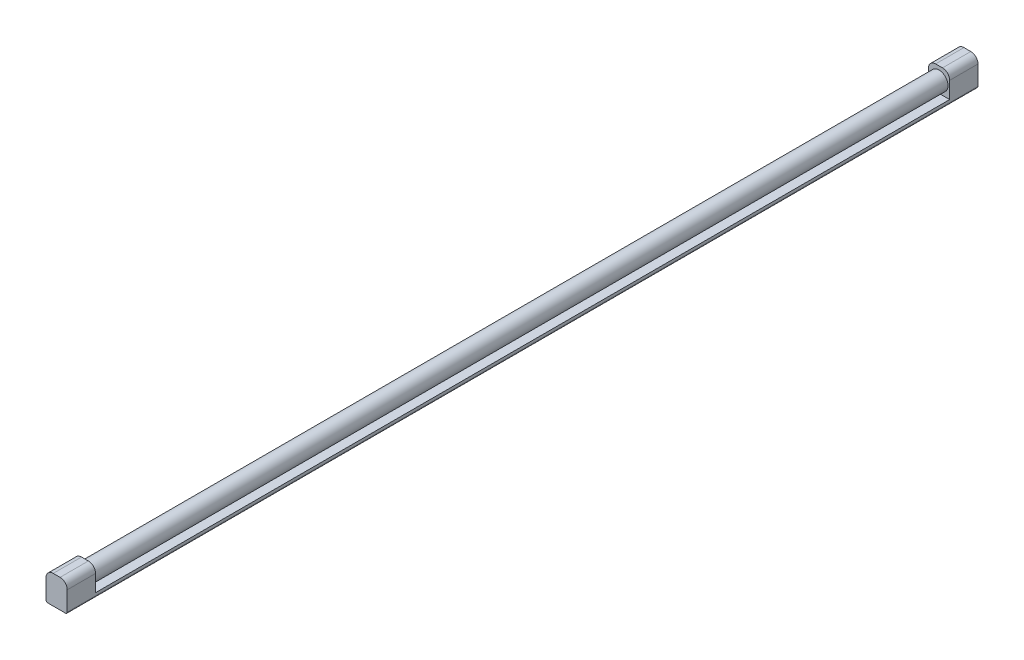
ISO-10303-21;
HEADER;
FILE_DESCRIPTION(('STEP AP214'),'2;1');
FILE_NAME('part.step','',(''),(''),'','','');
FILE_SCHEMA(('AUTOMOTIVE_DESIGN { 1 0 10303 214 1 1 1 1 }'));
ENDSEC;
DATA;
#1=APPLICATION_CONTEXT('core data for automotive mechanical design processes');
#2=APPLICATION_PROTOCOL_DEFINITION('international standard','automotive_design',2000,#1);
#3=PRODUCT_CONTEXT('',#1,'mechanical');
#4=PRODUCT('Part','Part','',(#3));
#5=PRODUCT_RELATED_PRODUCT_CATEGORY('part','',(#4));
#6=PRODUCT_DEFINITION_FORMATION('','',#4);
#7=PRODUCT_DEFINITION_CONTEXT('part definition',#1,'design');
#8=PRODUCT_DEFINITION('design','',#6,#7);
#9=PRODUCT_DEFINITION_SHAPE('','',#8);
#10=(LENGTH_UNIT() NAMED_UNIT(*) SI_UNIT(.MILLI.,.METRE.));
#11=(NAMED_UNIT(*) PLANE_ANGLE_UNIT() SI_UNIT($,.RADIAN.));
#12=(NAMED_UNIT(*) SI_UNIT($,.STERADIAN.) SOLID_ANGLE_UNIT());
#13=UNCERTAINTY_MEASURE_WITH_UNIT(LENGTH_MEASURE(1.E-05),#10,'distance_accuracy_value','');
#14=(GEOMETRIC_REPRESENTATION_CONTEXT(3) GLOBAL_UNCERTAINTY_ASSIGNED_CONTEXT((#13)) GLOBAL_UNIT_ASSIGNED_CONTEXT((#10,
#11,#12)) REPRESENTATION_CONTEXT('',''));
#15=CARTESIAN_POINT('',(0.,0.,0.));
#16=DIRECTION('',(0.,0.,1.));
#17=DIRECTION('',(1.,0.,0.));
#18=AXIS2_PLACEMENT_3D('',#15,#16,#17);
#19=CARTESIAN_POINT('',(0.,0.,40.));
#20=DIRECTION('',(0.,0.,-1.));
#21=DIRECTION('',(-1.,0.,0.));
#22=AXIS2_PLACEMENT_3D('',#19,#20,#21);
#23=PLANE('',#22);
#24=CARTESIAN_POINT('',(15.0000000000017,22.2200000000011,40.));
#25=DIRECTION('',(0.,0.,1.));
#26=DIRECTION('',(1.,0.,0.));
#27=AXIS2_PLACEMENT_3D('',#24,#25,#26);
#28=CIRCLE('',#27,12.7);
#29=CARTESIAN_POINT('',(27.7000000000017,22.2200000000011,40.));
#30=VERTEX_POINT('',#29);
#31=EDGE_CURVE('E230',#30,#30,#28,.T.);
#32=ORIENTED_EDGE('',*,*,#31,.F.);
#33=EDGE_LOOP('',(#32));
#34=FACE_BOUND('',#33,.T.);
#35=DIRECTION('',(-1.,0.,0.));
#36=VECTOR('',#35,1.);
#37=CARTESIAN_POINT('',(6.66133814775094E-12,6.35000000000008,40.));
#38=LINE('',#37,#36);
#39=CARTESIAN_POINT('',(30.0000000000066,6.35000000000052,40.));
#40=VERTEX_POINT('',#39);
#41=CARTESIAN_POINT('',(6.66133814775094E-12,6.35000000000008,40.));
#42=VERTEX_POINT('',#41);
#43=EDGE_CURVE('E51',#40,#42,#38,.T.);
#44=ORIENTED_EDGE('',*,*,#43,.F.);
#45=DIRECTION('',(0.,0.999999999999987,0.));
#46=VECTOR('',#45,1.);
#47=CARTESIAN_POINT('',(30.,4.44089209850063E-13,40.));
#48=LINE('',#47,#46);
#49=CARTESIAN_POINT('',(30.,29.8400000000003,40.));
#50=VERTEX_POINT('',#49);
#51=EDGE_CURVE('E285',#40,#50,#48,.T.);
#52=ORIENTED_EDGE('',*,*,#51,.T.);
#53=CARTESIAN_POINT('',(19.8400000000001,29.8400000000009,40.));
#54=DIRECTION('',(0.,0.,-1.));
#55=DIRECTION('',(-1.,0.,0.));
#56=AXIS2_PLACEMENT_3D('',#53,#54,#55);
#57=CIRCLE('',#56,10.16);
#58=CARTESIAN_POINT('',(19.840000000005,40.000000000001,40.));
#59=VERTEX_POINT('',#58);
#60=EDGE_CURVE('E314',#50,#59,#57,.F.);
#61=ORIENTED_EDGE('',*,*,#60,.T.);
#62=DIRECTION('',(-1.,0.,0.));
#63=VECTOR('',#62,1.);
#64=CARTESIAN_POINT('',(4.9960036108132E-12,40.,40.));
#65=LINE('',#64,#63);
#66=CARTESIAN_POINT('',(10.1600000000049,40.0000000000014,40.));
#67=VERTEX_POINT('',#66);
#68=EDGE_CURVE('E288',#59,#67,#65,.T.);
#69=ORIENTED_EDGE('',*,*,#68,.T.);
#70=CARTESIAN_POINT('',(10.1600000000001,29.8400000000012,40.));
#71=DIRECTION('',(0.,0.,-1.));
#72=DIRECTION('',(-1.,0.,0.));
#73=AXIS2_PLACEMENT_3D('',#70,#71,#72);
#74=CIRCLE('',#73,10.16);
#75=CARTESIAN_POINT('',(0.,29.8399999999999,40.));
#76=VERTEX_POINT('',#75);
#77=EDGE_CURVE('E312',#67,#76,#74,.F.);
#78=ORIENTED_EDGE('',*,*,#77,.T.);
#79=DIRECTION('',(0.,-0.999999999999987,0.));
#80=VECTOR('',#79,1.);
#81=CARTESIAN_POINT('',(0.,0.,40.));
#82=LINE('',#81,#80);
#83=EDGE_CURVE('E56',#76,#42,#82,.T.);
#84=ORIENTED_EDGE('',*,*,#83,.T.);
#85=EDGE_LOOP('',(#44,#52,#61,#69,#78,#84));
#86=FACE_BOUND('',#85,.T.);
#87=ADVANCED_FACE('F36',(#34,#86),#23,.F.);
#88=CARTESIAN_POINT('',(6.66133814775094E-12,6.66133814775094E-12,1246.));
#89=DIRECTION('',(0.,0.,-1.));
#90=DIRECTION('',(-1.,0.,0.));
#91=AXIS2_PLACEMENT_3D('',#88,#89,#90);
#92=PLANE('',#91);
#93=CARTESIAN_POINT('',(15.0000000000082,22.220000000011,1246.00000000001));
#94=DIRECTION('',(0.,0.,1.));
#95=DIRECTION('',(1.,0.,0.));
#96=AXIS2_PLACEMENT_3D('',#93,#94,#95);
#97=CIRCLE('',#96,12.7);
#98=CARTESIAN_POINT('',(27.7000000000082,22.220000000011,1246.00000000001));
#99=VERTEX_POINT('',#98);
#100=EDGE_CURVE('E278',#99,#99,#97,.T.);
#101=ORIENTED_EDGE('',*,*,#100,.T.);
#102=EDGE_LOOP('',(#101));
#103=FACE_BOUND('',#102,.T.);
#104=DIRECTION('',(0.,0.999999999999987,0.));
#105=VECTOR('',#104,1.);
#106=CARTESIAN_POINT('',(30.0000000000066,1.33226762955019E-11,1246.00000000001));
#107=LINE('',#106,#105);
#108=CARTESIAN_POINT('',(30.0000000000067,6.3500000000134,1246.00000000001));
#109=VERTEX_POINT('',#108);
#110=CARTESIAN_POINT('',(30.0000000000067,29.8400000000132,1246.00000000001));
#111=VERTEX_POINT('',#110);
#112=EDGE_CURVE('E267',#109,#111,#107,.T.);
#113=ORIENTED_EDGE('',*,*,#112,.F.);
#114=DIRECTION('',(1.,0.,0.));
#115=VECTOR('',#114,1.);
#116=CARTESIAN_POINT('',(6.66133814775094E-12,6.35000000000674,1246.));
#117=LINE('',#116,#115);
#118=CARTESIAN_POINT('',(6.66133814775094E-12,6.35000000000674,1246.));
#119=VERTEX_POINT('',#118);
#120=EDGE_CURVE('E266',#119,#109,#117,.T.);
#121=ORIENTED_EDGE('',*,*,#120,.F.);
#122=DIRECTION('',(0.,-0.999999999999987,0.));
#123=VECTOR('',#122,1.);
#124=CARTESIAN_POINT('',(6.66133814775094E-12,6.66133814775094E-12,1246.));
#125=LINE('',#124,#123);
#126=CARTESIAN_POINT('',(6.66133814775094E-12,29.8400000000065,1246.00000000001));
#127=VERTEX_POINT('',#126);
#128=EDGE_CURVE('E255',#127,#119,#125,.T.);
#129=ORIENTED_EDGE('',*,*,#128,.F.);
#130=CARTESIAN_POINT('',(10.1600000000066,29.8400000000079,1246.00000000001));
#131=DIRECTION('',(0.,0.,-1.));
#132=DIRECTION('',(-1.,0.,0.));
#133=AXIS2_PLACEMENT_3D('',#130,#131,#132);
#134=CIRCLE('',#133,10.16);
#135=CARTESIAN_POINT('',(10.1600000000051,40.000000000008,1246.00000000001));
#136=VERTEX_POINT('',#135);
#137=EDGE_CURVE('E236',#127,#136,#134,.T.);
#138=ORIENTED_EDGE('',*,*,#137,.T.);
#139=DIRECTION('',(-1.,0.,0.));
#140=VECTOR('',#139,1.);
#141=CARTESIAN_POINT('',(4.9960036108132E-12,40.0000000000067,1246.00000000001));
#142=LINE('',#141,#140);
#143=CARTESIAN_POINT('',(19.8400000000051,40.0000000000109,1246.00000000001));
#144=VERTEX_POINT('',#143);
#145=EDGE_CURVE('E269',#144,#136,#142,.T.);
#146=ORIENTED_EDGE('',*,*,#145,.F.);
#147=CARTESIAN_POINT('',(19.8400000000066,29.8400000000107,1246.00000000001));
#148=DIRECTION('',(0.,0.,-1.));
#149=DIRECTION('',(-1.,0.,0.));
#150=AXIS2_PLACEMENT_3D('',#147,#148,#149);
#151=CIRCLE('',#150,10.16);
#152=EDGE_CURVE('E238',#144,#111,#151,.T.);
#153=ORIENTED_EDGE('',*,*,#152,.T.);
#154=EDGE_LOOP('',(#113,#121,#129,#138,#146,#153));
#155=FACE_BOUND('',#154,.T.);
#156=ADVANCED_FACE('F262',(#103,#155),#92,.T.);
#157=CARTESIAN_POINT('',(0.,0.,40.));
#158=DIRECTION('',(1.,0.,0.));
#159=DIRECTION('',(0.,0.,-1.));
#160=AXIS2_PLACEMENT_3D('',#157,#158,#159);
#161=PLANE('',#160);
#162=DIRECTION('',(0.,0.,-1.));
#163=VECTOR('',#162,1.);
#164=CARTESIAN_POINT('',(0.,2.53999999999999,40.));
#165=LINE('',#164,#163);
#166=CARTESIAN_POINT('',(0.,2.53999999999999,0.));
#167=VERTEX_POINT('',#166);
#168=CARTESIAN_POINT('',(0.,2.53999999999999,40.));
#169=VERTEX_POINT('',#168);
#170=EDGE_CURVE('E222',#167,#169,#165,.F.);
#171=ORIENTED_EDGE('',*,*,#170,.T.);
#172=DIRECTION('',(0.,0.,-1.));
#173=VECTOR('',#172,1.);
#174=CARTESIAN_POINT('',(0.,2.53999999999999,40.));
#175=LINE('',#174,#173);
#176=CARTESIAN_POINT('',(6.66133814775094E-12,2.54000000000665,1246.));
#177=VERTEX_POINT('',#176);
#178=EDGE_CURVE('E11',#169,#177,#175,.F.);
#179=ORIENTED_EDGE('',*,*,#178,.T.);
#180=DIRECTION('',(0.,0.,-1.));
#181=VECTOR('',#180,1.);
#182=CARTESIAN_POINT('',(0.,2.54000000001031,1286.00000001));
#183=LINE('',#182,#181);
#184=CARTESIAN_POINT('',(0.,2.54000000001031,1286.00000001));
#185=VERTEX_POINT('',#184);
#186=EDGE_CURVE('E187',#177,#185,#183,.F.);
#187=ORIENTED_EDGE('',*,*,#186,.T.);
#188=DIRECTION('',(0.,-0.999999999999987,0.));
#189=VECTOR('',#188,1.);
#190=CARTESIAN_POINT('',(0.,1.0325074129014E-11,1286.00000001));
#191=LINE('',#190,#189);
#192=CARTESIAN_POINT('',(0.,29.8400000000102,1286.00000001001));
#193=VERTEX_POINT('',#192);
#194=EDGE_CURVE('E258',#193,#185,#191,.T.);
#195=ORIENTED_EDGE('',*,*,#194,.F.);
#196=DIRECTION('',(0.,0.,-1.));
#197=VECTOR('',#196,1.);
#198=CARTESIAN_POINT('',(0.,29.8400000000102,1286.00000001001));
#199=LINE('',#198,#197);
#200=EDGE_CURVE('E178',#193,#127,#199,.T.);
#201=ORIENTED_EDGE('',*,*,#200,.T.);
#202=ORIENTED_EDGE('',*,*,#128,.T.);
#203=DIRECTION('',(0.,0.,-1.));
#204=VECTOR('',#203,1.);
#205=CARTESIAN_POINT('',(0.,6.3500000000104,1276.66467837758));
#206=LINE('',#205,#204);
#207=EDGE_CURVE('E341',#119,#42,#206,.T.);
#208=ORIENTED_EDGE('',*,*,#207,.T.);
#209=ORIENTED_EDGE('',*,*,#83,.F.);
#210=DIRECTION('',(0.,0.,-1.));
#211=VECTOR('',#210,1.);
#212=CARTESIAN_POINT('',(0.,29.8399999999999,40.));
#213=LINE('',#212,#211);
#214=CARTESIAN_POINT('',(0.,29.8399999999999,0.));
#215=VERTEX_POINT('',#214);
#216=EDGE_CURVE('E217',#76,#215,#213,.T.);
#217=ORIENTED_EDGE('',*,*,#216,.T.);
#218=DIRECTION('',(0.,-0.999999999999987,0.));
#219=VECTOR('',#218,1.);
#220=CARTESIAN_POINT('',(0.,0.,0.));
#221=LINE('',#220,#219);
#222=EDGE_CURVE('E281',#215,#167,#221,.T.);
#223=ORIENTED_EDGE('',*,*,#222,.T.);
#224=EDGE_LOOP('',(#171,#179,#187,#195,#201,#202,#208,#209,#217,#223));
#225=FACE_BOUND('',#224,.T.);
#226=ADVANCED_FACE('F254',(#225),#161,.F.);
#227=CARTESIAN_POINT('',(0.,0.,40.));
#228=DIRECTION('',(0.,0.999999999999987,0.));
#229=DIRECTION('',(0.,0.,1.));
#230=AXIS2_PLACEMENT_3D('',#227,#228,#229);
#231=PLANE('',#230);
#232=DIRECTION('',(0.,0.,-1.));
#233=VECTOR('',#232,1.);
#234=CARTESIAN_POINT('',(27.46,6.66133814775094E-12,40.));
#235=LINE('',#234,#233);
#236=CARTESIAN_POINT('',(27.46,4.44089209850063E-13,0.));
#237=VERTEX_POINT('',#236);
#238=CARTESIAN_POINT('',(27.46,6.66133814775094E-12,40.));
#239=VERTEX_POINT('',#238);
#240=EDGE_CURVE('E165',#237,#239,#235,.F.);
#241=ORIENTED_EDGE('',*,*,#240,.T.);
#242=DIRECTION('',(0.,0.,-1.));
#243=VECTOR('',#242,1.);
#244=CARTESIAN_POINT('',(27.46,6.66133814775094E-12,40.));
#245=LINE('',#244,#243);
#246=CARTESIAN_POINT('',(27.4600000000066,1.33226762955019E-11,1246.00000000001));
#247=VERTEX_POINT('',#246);
#248=EDGE_CURVE('E44',#239,#247,#245,.F.);
#249=ORIENTED_EDGE('',*,*,#248,.T.);
#250=DIRECTION('',(0.,0.,-1.));
#251=VECTOR('',#250,1.);
#252=CARTESIAN_POINT('',(27.46,1.65423230669148E-11,1286.00000001001));
#253=LINE('',#252,#251);
#254=CARTESIAN_POINT('',(27.46,1.65423230669148E-11,1286.00000001001));
#255=VERTEX_POINT('',#254);
#256=EDGE_CURVE('E161',#247,#255,#253,.F.);
#257=ORIENTED_EDGE('',*,*,#256,.T.);
#258=DIRECTION('',(1.,0.,0.));
#259=VECTOR('',#258,1.);
#260=CARTESIAN_POINT('',(0.,1.0325074129014E-11,1286.00000001));
#261=LINE('',#260,#259);
#262=CARTESIAN_POINT('',(2.53999999999999,7.54951656745106E-12,1286.00000001));
#263=VERTEX_POINT('',#262);
#264=EDGE_CURVE('E334',#263,#255,#261,.T.);
#265=ORIENTED_EDGE('',*,*,#264,.F.);
#266=DIRECTION('',(0.,0.,-1.));
#267=VECTOR('',#266,1.);
#268=CARTESIAN_POINT('',(2.53999999999999,7.54951656745106E-12,1286.00000001));
#269=LINE('',#268,#267);
#270=CARTESIAN_POINT('',(2.54000000000665,7.54951656745106E-12,1246.));
#271=VERTEX_POINT('',#270);
#272=EDGE_CURVE('E177',#263,#271,#269,.T.);
#273=ORIENTED_EDGE('',*,*,#272,.T.);
#274=DIRECTION('',(0.,0.,-1.));
#275=VECTOR('',#274,1.);
#276=CARTESIAN_POINT('',(2.53999999999999,4.44089209850063E-13,40.));
#277=LINE('',#276,#275);
#278=CARTESIAN_POINT('',(2.53999999999999,4.44089209850063E-13,40.));
#279=VERTEX_POINT('',#278);
#280=EDGE_CURVE('E169',#271,#279,#277,.T.);
#281=ORIENTED_EDGE('',*,*,#280,.T.);
#282=DIRECTION('',(0.,0.,-1.));
#283=VECTOR('',#282,1.);
#284=CARTESIAN_POINT('',(2.53999999999999,4.44089209850063E-13,40.));
#285=LINE('',#284,#283);
#286=CARTESIAN_POINT('',(2.53999999999999,4.44089209850063E-13,0.));
#287=VERTEX_POINT('',#286);
#288=EDGE_CURVE('E203',#279,#287,#285,.T.);
#289=ORIENTED_EDGE('',*,*,#288,.T.);
#290=DIRECTION('',(1.,0.,0.));
#291=VECTOR('',#290,1.);
#292=CARTESIAN_POINT('',(0.,0.,0.));
#293=LINE('',#292,#291);
#294=EDGE_CURVE('E294',#287,#237,#293,.T.);
#295=ORIENTED_EDGE('',*,*,#294,.T.);
#296=EDGE_LOOP('',(#241,#249,#257,#265,#273,#281,#289,#295));
#297=FACE_BOUND('',#296,.T.);
#298=ADVANCED_FACE('F159',(#297),#231,.F.);
#299=CARTESIAN_POINT('',(30.,4.44089209850063E-13,40.));
#300=DIRECTION('',(-1.,0.,0.));
#301=DIRECTION('',(0.,0.,1.));
#302=AXIS2_PLACEMENT_3D('',#299,#300,#301);
#303=PLANE('',#302);
#304=DIRECTION('',(0.,0.,-1.));
#305=VECTOR('',#304,1.);
#306=CARTESIAN_POINT('',(30.,2.54000000001331,1286.00000001001));
#307=LINE('',#306,#305);
#308=CARTESIAN_POINT('',(30.,2.54000000001331,1286.00000001001));
#309=VERTEX_POINT('',#308);
#310=CARTESIAN_POINT('',(30.0000000000067,2.54000000001331,1246.00000000001));
#311=VERTEX_POINT('',#310);
#312=EDGE_CURVE('E196',#309,#311,#307,.T.);
#313=ORIENTED_EDGE('',*,*,#312,.T.);
#314=DIRECTION('',(0.,0.,-1.));
#315=VECTOR('',#314,1.);
#316=CARTESIAN_POINT('',(30.,2.54000000000043,40.));
#317=LINE('',#316,#315);
#318=CARTESIAN_POINT('',(30.,2.54000000000043,40.));
#319=VERTEX_POINT('',#318);
#320=EDGE_CURVE('E183',#311,#319,#317,.T.);
#321=ORIENTED_EDGE('',*,*,#320,.T.);
#322=DIRECTION('',(0.,0.,-1.));
#323=VECTOR('',#322,1.);
#324=CARTESIAN_POINT('',(30.,2.54000000000043,40.));
#325=LINE('',#324,#323);
#326=CARTESIAN_POINT('',(30.,2.54000000000043,0.));
#327=VERTEX_POINT('',#326);
#328=EDGE_CURVE('E227',#319,#327,#325,.T.);
#329=ORIENTED_EDGE('',*,*,#328,.T.);
#330=DIRECTION('',(0.,0.999999999999987,0.));
#331=VECTOR('',#330,1.);
#332=CARTESIAN_POINT('',(30.,4.44089209850063E-13,0.));
#333=LINE('',#332,#331);
#334=CARTESIAN_POINT('',(30.,29.8400000000003,0.));
#335=VERTEX_POINT('',#334);
#336=EDGE_CURVE('E296',#327,#335,#333,.T.);
#337=ORIENTED_EDGE('',*,*,#336,.T.);
#338=DIRECTION('',(0.,0.,-1.));
#339=VECTOR('',#338,1.);
#340=CARTESIAN_POINT('',(30.,29.8400000000003,40.));
#341=LINE('',#340,#339);
#342=EDGE_CURVE('E309',#335,#50,#341,.F.);
#343=ORIENTED_EDGE('',*,*,#342,.T.);
#344=ORIENTED_EDGE('',*,*,#51,.F.);
#345=DIRECTION('',(0.,0.,-1.));
#346=VECTOR('',#345,1.);
#347=CARTESIAN_POINT('',(30.,6.3500000000134,1276.66467837758));
#348=LINE('',#347,#346);
#349=EDGE_CURVE('E271',#109,#40,#348,.T.);
#350=ORIENTED_EDGE('',*,*,#349,.F.);
#351=ORIENTED_EDGE('',*,*,#112,.T.);
#352=DIRECTION('',(0.,0.,-1.));
#353=VECTOR('',#352,1.);
#354=CARTESIAN_POINT('',(30.,29.8400000000132,1286.00000001001));
#355=LINE('',#354,#353);
#356=CARTESIAN_POINT('',(30.,29.8400000000132,1286.00000001001));
#357=VERTEX_POINT('',#356);
#358=EDGE_CURVE('E241',#111,#357,#355,.F.);
#359=ORIENTED_EDGE('',*,*,#358,.T.);
#360=DIRECTION('',(0.,0.999999999999987,0.));
#361=VECTOR('',#360,1.);
#362=CARTESIAN_POINT('',(30.,1.33226762955019E-11,1286.00000001001));
#363=LINE('',#362,#361);
#364=EDGE_CURVE('E330',#309,#357,#363,.T.);
#365=ORIENTED_EDGE('',*,*,#364,.F.);
#366=EDGE_LOOP('',(#313,#321,#329,#337,#343,#344,#350,#351,#359,#365));
#367=FACE_BOUND('',#366,.T.);
#368=ADVANCED_FACE('F328',(#367),#303,.F.);
#369=CARTESIAN_POINT('',(4.9960036108132E-12,40.,40.));
#370=DIRECTION('',(0.,-0.999999999999987,0.));
#371=DIRECTION('',(0.,0.,-1.));
#372=AXIS2_PLACEMENT_3D('',#369,#370,#371);
#373=PLANE('',#372);
#374=ORIENTED_EDGE('',*,*,#68,.F.);
#375=DIRECTION('',(0.,0.,-1.));
#376=VECTOR('',#375,1.);
#377=CARTESIAN_POINT('',(19.840000000005,40.000000000001,40.));
#378=LINE('',#377,#376);
#379=CARTESIAN_POINT('',(19.840000000005,40.000000000001,0.));
#380=VERTEX_POINT('',#379);
#381=EDGE_CURVE('E301',#59,#380,#378,.T.);
#382=ORIENTED_EDGE('',*,*,#381,.T.);
#383=DIRECTION('',(-1.,0.,0.));
#384=VECTOR('',#383,1.);
#385=CARTESIAN_POINT('',(4.9960036108132E-12,40.,0.));
#386=LINE('',#385,#384);
#387=CARTESIAN_POINT('',(10.1600000000049,40.0000000000014,0.));
#388=VERTEX_POINT('',#387);
#389=EDGE_CURVE('E286',#380,#388,#386,.T.);
#390=ORIENTED_EDGE('',*,*,#389,.T.);
#391=DIRECTION('',(0.,0.,-1.));
#392=VECTOR('',#391,1.);
#393=CARTESIAN_POINT('',(10.1600000000049,40.0000000000014,40.));
#394=LINE('',#393,#392);
#395=EDGE_CURVE('E291',#388,#67,#394,.F.);
#396=ORIENTED_EDGE('',*,*,#395,.T.);
#397=EDGE_LOOP('',(#374,#382,#390,#396));
#398=FACE_BOUND('',#397,.T.);
#399=ADVANCED_FACE('F352',(#398),#373,.F.);
#400=CARTESIAN_POINT('',(0.,0.,0.));
#401=DIRECTION('',(0.,0.,-1.));
#402=DIRECTION('',(-1.,0.,0.));
#403=AXIS2_PLACEMENT_3D('',#400,#401,#402);
#404=PLANE('',#403);
#405=ORIENTED_EDGE('',*,*,#294,.F.);
#406=CARTESIAN_POINT('',(2.53999999999999,2.54000000000043,0.));
#407=DIRECTION('',(0.,0.,-1.));
#408=DIRECTION('',(-1.,0.,0.));
#409=AXIS2_PLACEMENT_3D('',#406,#407,#408);
#410=CIRCLE('',#409,2.54);
#411=EDGE_CURVE('E213',#287,#167,#410,.T.);
#412=ORIENTED_EDGE('',*,*,#411,.T.);
#413=ORIENTED_EDGE('',*,*,#222,.F.);
#414=CARTESIAN_POINT('',(10.1600000000001,29.8400000000012,0.));
#415=DIRECTION('',(0.,0.,-1.));
#416=DIRECTION('',(-1.,0.,0.));
#417=AXIS2_PLACEMENT_3D('',#414,#415,#416);
#418=CIRCLE('',#417,10.16);
#419=EDGE_CURVE('E304',#215,#388,#418,.T.);
#420=ORIENTED_EDGE('',*,*,#419,.T.);
#421=ORIENTED_EDGE('',*,*,#389,.F.);
#422=CARTESIAN_POINT('',(19.84,29.8400000000009,0.));
#423=DIRECTION('',(0.,0.,-1.));
#424=DIRECTION('',(-1.,0.,0.));
#425=AXIS2_PLACEMENT_3D('',#422,#423,#424);
#426=CIRCLE('',#425,10.16);
#427=EDGE_CURVE('E306',#380,#335,#426,.T.);
#428=ORIENTED_EDGE('',*,*,#427,.T.);
#429=ORIENTED_EDGE('',*,*,#336,.F.);
#430=CARTESIAN_POINT('',(27.46,2.54000000000043,0.));
#431=DIRECTION('',(0.,0.,-1.));
#432=DIRECTION('',(-1.,0.,0.));
#433=AXIS2_PLACEMENT_3D('',#430,#431,#432);
#434=CIRCLE('',#433,2.54);
#435=EDGE_CURVE('E214',#327,#237,#434,.T.);
#436=ORIENTED_EDGE('',*,*,#435,.T.);
#437=EDGE_LOOP('',(#405,#412,#413,#420,#421,#428,#429,#436));
#438=FACE_BOUND('',#437,.T.);
#439=ADVANCED_FACE('F321',(#438),#404,.T.);
#440=CARTESIAN_POINT('',(19.8400000000001,29.8400000000009,40.));
#441=DIRECTION('',(0.,0.,-1.));
#442=DIRECTION('',(-1.,0.,0.));
#443=AXIS2_PLACEMENT_3D('',#440,#441,#442);
#444=CYLINDRICAL_SURFACE('',#443,10.16);
#445=ORIENTED_EDGE('',*,*,#60,.F.);
#446=ORIENTED_EDGE('',*,*,#342,.F.);
#447=ORIENTED_EDGE('',*,*,#427,.F.);
#448=ORIENTED_EDGE('',*,*,#381,.F.);
#449=EDGE_LOOP('',(#445,#446,#447,#448));
#450=FACE_BOUND('',#449,.T.);
#451=ADVANCED_FACE('F354',(#450),#444,.T.);
#452=CARTESIAN_POINT('',(10.1600000000001,29.8400000000012,40.));
#453=DIRECTION('',(0.,0.,-1.));
#454=DIRECTION('',(-1.,0.,0.));
#455=AXIS2_PLACEMENT_3D('',#452,#453,#454);
#456=CYLINDRICAL_SURFACE('',#455,10.16);
#457=ORIENTED_EDGE('',*,*,#77,.F.);
#458=ORIENTED_EDGE('',*,*,#395,.F.);
#459=ORIENTED_EDGE('',*,*,#419,.F.);
#460=ORIENTED_EDGE('',*,*,#216,.F.);
#461=EDGE_LOOP('',(#457,#458,#459,#460));
#462=FACE_BOUND('',#461,.T.);
#463=ADVANCED_FACE('F355',(#462),#456,.T.);
#464=CARTESIAN_POINT('',(2.5400000000001,2.54000000000043,40.));
#465=DIRECTION('',(0.,0.,-1.));
#466=DIRECTION('',(-1.,0.,0.));
#467=AXIS2_PLACEMENT_3D('',#464,#465,#466);
#468=CYLINDRICAL_SURFACE('',#467,2.54);
#469=CARTESIAN_POINT('',(2.5400000000001,2.54000000000043,40.));
#470=DIRECTION('',(0.,0.,-1.));
#471=DIRECTION('',(-1.,0.,0.));
#472=AXIS2_PLACEMENT_3D('',#469,#470,#471);
#473=CIRCLE('',#472,2.54);
#474=EDGE_CURVE('E211',#169,#279,#473,.F.);
#475=ORIENTED_EDGE('',*,*,#474,.F.);
#476=ORIENTED_EDGE('',*,*,#170,.F.);
#477=ORIENTED_EDGE('',*,*,#411,.F.);
#478=ORIENTED_EDGE('',*,*,#288,.F.);
#479=EDGE_LOOP('',(#475,#476,#477,#478));
#480=FACE_BOUND('',#479,.T.);
#481=ADVANCED_FACE('F209',(#480),#468,.T.);
#482=CARTESIAN_POINT('',(27.46,2.54000000000665,40.));
#483=DIRECTION('',(0.,0.,-1.));
#484=DIRECTION('',(-1.,0.,0.));
#485=AXIS2_PLACEMENT_3D('',#482,#483,#484);
#486=CYLINDRICAL_SURFACE('',#485,2.54);
#487=CARTESIAN_POINT('',(27.46,2.54000000000665,40.));
#488=DIRECTION('',(0.,0.,-1.));
#489=DIRECTION('',(-1.,0.,0.));
#490=AXIS2_PLACEMENT_3D('',#487,#488,#489);
#491=CIRCLE('',#490,2.54);
#492=EDGE_CURVE('E224',#239,#319,#491,.F.);
#493=ORIENTED_EDGE('',*,*,#492,.F.);
#494=ORIENTED_EDGE('',*,*,#240,.F.);
#495=ORIENTED_EDGE('',*,*,#435,.F.);
#496=ORIENTED_EDGE('',*,*,#328,.F.);
#497=EDGE_LOOP('',(#493,#494,#495,#496));
#498=FACE_BOUND('',#497,.T.);
#499=ADVANCED_FACE('F325',(#498),#486,.T.);
#500=CARTESIAN_POINT('',(15.0000000000082,22.220000000011,1246.00000000001));
#501=DIRECTION('',(0.,0.,-1.));
#502=DIRECTION('',(-1.,0.,0.));
#503=AXIS2_PLACEMENT_3D('',#500,#501,#502);
#504=CYLINDRICAL_SURFACE('',#503,12.7);
#505=ORIENTED_EDGE('',*,*,#100,.F.);
#506=EDGE_LOOP('',(#505));
#507=FACE_BOUND('',#506,.T.);
#508=ORIENTED_EDGE('',*,*,#31,.T.);
#509=EDGE_LOOP('',(#508));
#510=FACE_BOUND('',#509,.T.);
#511=ADVANCED_FACE('F375',(#507,#510),#504,.T.);
#512=CARTESIAN_POINT('',(4.9960036108132E-12,40.0000000000098,1286.00000001001));
#513=DIRECTION('',(0.,-0.999999999999987,0.));
#514=DIRECTION('',(0.,0.,-1.));
#515=AXIS2_PLACEMENT_3D('',#512,#513,#514);
#516=PLANE('',#515);
#517=DIRECTION('',(-1.,0.,0.));
#518=VECTOR('',#517,1.);
#519=CARTESIAN_POINT('',(4.9960036108132E-12,40.0000000000098,1286.00000001001));
#520=LINE('',#519,#518);
#521=CARTESIAN_POINT('',(19.840000000005,40.0000000000109,1286.00000001001));
#522=VERTEX_POINT('',#521);
#523=CARTESIAN_POINT('',(10.1600000000049,40.000000000008,1286.00000001001));
#524=VERTEX_POINT('',#523);
#525=EDGE_CURVE('E274',#522,#524,#520,.T.);
#526=ORIENTED_EDGE('',*,*,#525,.F.);
#527=DIRECTION('',(0.,0.,-1.));
#528=VECTOR('',#527,1.);
#529=CARTESIAN_POINT('',(19.840000000005,40.0000000000109,1286.00000001001));
#530=LINE('',#529,#528);
#531=EDGE_CURVE('E233',#522,#144,#530,.T.);
#532=ORIENTED_EDGE('',*,*,#531,.T.);
#533=ORIENTED_EDGE('',*,*,#145,.T.);
#534=DIRECTION('',(0.,0.,-1.));
#535=VECTOR('',#534,1.);
#536=CARTESIAN_POINT('',(10.1600000000049,40.000000000008,1286.00000001001));
#537=LINE('',#536,#535);
#538=EDGE_CURVE('E231',#136,#524,#537,.F.);
#539=ORIENTED_EDGE('',*,*,#538,.T.);
#540=EDGE_LOOP('',(#526,#532,#533,#539));
#541=FACE_BOUND('',#540,.T.);
#542=ADVANCED_FACE('F437',(#541),#516,.F.);
#543=CARTESIAN_POINT('',(0.,1.0325074129014E-11,1286.00000001));
#544=DIRECTION('',(0.,0.,-1.));
#545=DIRECTION('',(-1.,0.,0.));
#546=AXIS2_PLACEMENT_3D('',#543,#544,#545);
#547=PLANE('',#546);
#548=ORIENTED_EDGE('',*,*,#194,.T.);
#549=CARTESIAN_POINT('',(2.53999999999999,2.54000000000754,1286.00000001));
#550=DIRECTION('',(0.,0.,-1.));
#551=DIRECTION('',(-1.,0.,0.));
#552=AXIS2_PLACEMENT_3D('',#549,#550,#551);
#553=CIRCLE('',#552,2.54);
#554=EDGE_CURVE('E194',#185,#263,#553,.F.);
#555=ORIENTED_EDGE('',*,*,#554,.T.);
#556=ORIENTED_EDGE('',*,*,#264,.T.);
#557=CARTESIAN_POINT('',(27.46,2.54000000001497,1286.00000001001));
#558=DIRECTION('',(0.,0.,-1.));
#559=DIRECTION('',(-1.,0.,0.));
#560=AXIS2_PLACEMENT_3D('',#557,#558,#559);
#561=CIRCLE('',#560,2.54);
#562=EDGE_CURVE('E176',#255,#309,#561,.F.);
#563=ORIENTED_EDGE('',*,*,#562,.T.);
#564=ORIENTED_EDGE('',*,*,#364,.T.);
#565=CARTESIAN_POINT('',(19.84,29.8400000000107,1286.00000001001));
#566=DIRECTION('',(0.,0.,-1.));
#567=DIRECTION('',(-1.,0.,0.));
#568=AXIS2_PLACEMENT_3D('',#565,#566,#567);
#569=CIRCLE('',#568,10.16);
#570=EDGE_CURVE('E246',#357,#522,#569,.F.);
#571=ORIENTED_EDGE('',*,*,#570,.T.);
#572=ORIENTED_EDGE('',*,*,#525,.T.);
#573=CARTESIAN_POINT('',(10.1600000000001,29.8400000000079,1286.00000001001));
#574=DIRECTION('',(0.,0.,-1.));
#575=DIRECTION('',(-1.,0.,0.));
#576=AXIS2_PLACEMENT_3D('',#573,#574,#575);
#577=CIRCLE('',#576,10.16);
#578=EDGE_CURVE('E244',#524,#193,#577,.F.);
#579=ORIENTED_EDGE('',*,*,#578,.T.);
#580=EDGE_LOOP('',(#548,#555,#556,#563,#564,#571,#572,#579));
#581=FACE_BOUND('',#580,.T.);
#582=ADVANCED_FACE('F446',(#581),#547,.F.);
#583=CARTESIAN_POINT('',(19.84,29.8400000000107,1286.00000001001));
#584=DIRECTION('',(0.,0.,-1.));
#585=DIRECTION('',(-1.,0.,0.));
#586=AXIS2_PLACEMENT_3D('',#583,#584,#585);
#587=CYLINDRICAL_SURFACE('',#586,10.16);
#588=ORIENTED_EDGE('',*,*,#570,.F.);
#589=ORIENTED_EDGE('',*,*,#358,.F.);
#590=ORIENTED_EDGE('',*,*,#152,.F.);
#591=ORIENTED_EDGE('',*,*,#531,.F.);
#592=EDGE_LOOP('',(#588,#589,#590,#591));
#593=FACE_BOUND('',#592,.T.);
#594=ADVANCED_FACE('F455',(#593),#587,.T.);
#595=CARTESIAN_POINT('',(10.1600000000001,29.8400000000079,1286.00000001001));
#596=DIRECTION('',(0.,0.,-1.));
#597=DIRECTION('',(-1.,0.,0.));
#598=AXIS2_PLACEMENT_3D('',#595,#596,#597);
#599=CYLINDRICAL_SURFACE('',#598,10.16);
#600=ORIENTED_EDGE('',*,*,#578,.F.);
#601=ORIENTED_EDGE('',*,*,#538,.F.);
#602=ORIENTED_EDGE('',*,*,#137,.F.);
#603=ORIENTED_EDGE('',*,*,#200,.F.);
#604=EDGE_LOOP('',(#600,#601,#602,#603));
#605=FACE_BOUND('',#604,.T.);
#606=ADVANCED_FACE('F464',(#605),#599,.T.);
#607=CARTESIAN_POINT('',(2.53999999999999,2.54000000000754,1286.00000001));
#608=DIRECTION('',(0.,0.,-1.));
#609=DIRECTION('',(-1.,0.,0.));
#610=AXIS2_PLACEMENT_3D('',#607,#608,#609);
#611=CYLINDRICAL_SURFACE('',#610,2.54);
#612=ORIENTED_EDGE('',*,*,#554,.F.);
#613=ORIENTED_EDGE('',*,*,#186,.F.);
#614=CARTESIAN_POINT('',(2.54000000000665,2.54000000000754,1246.));
#615=DIRECTION('',(0.,0.,-1.));
#616=DIRECTION('',(-1.,0.,0.));
#617=AXIS2_PLACEMENT_3D('',#614,#615,#616);
#618=CIRCLE('',#617,2.54);
#619=EDGE_CURVE('E184',#271,#177,#618,.T.);
#620=ORIENTED_EDGE('',*,*,#619,.F.);
#621=ORIENTED_EDGE('',*,*,#272,.F.);
#622=EDGE_LOOP('',(#612,#613,#620,#621));
#623=FACE_BOUND('',#622,.T.);
#624=ADVANCED_FACE('F474',(#623),#611,.T.);
#625=CARTESIAN_POINT('',(27.46,2.54000000001497,1286.00000001001));
#626=DIRECTION('',(0.,0.,-1.));
#627=DIRECTION('',(-1.,0.,0.));
#628=AXIS2_PLACEMENT_3D('',#625,#626,#627);
#629=CYLINDRICAL_SURFACE('',#628,2.54);
#630=ORIENTED_EDGE('',*,*,#562,.F.);
#631=ORIENTED_EDGE('',*,*,#256,.F.);
#632=CARTESIAN_POINT('',(27.4600000000066,2.54000000001331,1246.00000000001));
#633=DIRECTION('',(0.,0.,-1.));
#634=DIRECTION('',(-1.,0.,0.));
#635=AXIS2_PLACEMENT_3D('',#632,#633,#634);
#636=CIRCLE('',#635,2.54);
#637=EDGE_CURVE('E174',#311,#247,#636,.T.);
#638=ORIENTED_EDGE('',*,*,#637,.F.);
#639=ORIENTED_EDGE('',*,*,#312,.F.);
#640=EDGE_LOOP('',(#630,#631,#638,#639));
#641=FACE_BOUND('',#640,.T.);
#642=ADVANCED_FACE('F172',(#641),#629,.T.);
#643=CARTESIAN_POINT('',(0.,6.3500000000104,1276.66467837758));
#644=DIRECTION('',(0.,-0.999999999999987,0.));
#645=DIRECTION('',(0.,0.,-1.));
#646=AXIS2_PLACEMENT_3D('',#643,#644,#645);
#647=PLANE('',#646);
#648=ORIENTED_EDGE('',*,*,#207,.F.);
#649=ORIENTED_EDGE('',*,*,#120,.T.);
#650=ORIENTED_EDGE('',*,*,#349,.T.);
#651=ORIENTED_EDGE('',*,*,#43,.T.);
#652=EDGE_LOOP('',(#648,#649,#650,#651));
#653=FACE_BOUND('',#652,.T.);
#654=ADVANCED_FACE('F344',(#653),#647,.F.);
#655=CARTESIAN_POINT('',(27.46,2.54000000000665,40.));
#656=DIRECTION('',(0.,0.,-1.));
#657=DIRECTION('',(-1.,0.,0.));
#658=AXIS2_PLACEMENT_3D('',#655,#656,#657);
#659=CYLINDRICAL_SURFACE('',#658,2.54);
#660=ORIENTED_EDGE('',*,*,#637,.T.);
#661=ORIENTED_EDGE('',*,*,#248,.F.);
#662=ORIENTED_EDGE('',*,*,#492,.T.);
#663=ORIENTED_EDGE('',*,*,#320,.F.);
#664=EDGE_LOOP('',(#660,#661,#662,#663));
#665=FACE_BOUND('',#664,.T.);
#666=ADVANCED_FACE('F181',(#665),#659,.T.);
#667=CARTESIAN_POINT('',(2.5400000000001,2.54000000000043,40.));
#668=DIRECTION('',(0.,0.,-1.));
#669=DIRECTION('',(-1.,0.,0.));
#670=AXIS2_PLACEMENT_3D('',#667,#668,#669);
#671=CYLINDRICAL_SURFACE('',#670,2.54);
#672=ORIENTED_EDGE('',*,*,#619,.T.);
#673=ORIENTED_EDGE('',*,*,#178,.F.);
#674=ORIENTED_EDGE('',*,*,#474,.T.);
#675=ORIENTED_EDGE('',*,*,#280,.F.);
#676=EDGE_LOOP('',(#672,#673,#674,#675));
#677=FACE_BOUND('',#676,.T.);
#678=ADVANCED_FACE('F38',(#677),#671,.T.);
#679=CLOSED_SHELL('',(#87,#156,#226,#298,#368,#399,#439,#451,#463,#481,#499,#511,#542,#582,#594,
#606,#624,#642,#654,#666,#678));
#680=MANIFOLD_SOLID_BREP('B2',#679);
#681=ADVANCED_BREP_SHAPE_REPRESENTATION('',(#18,#680),#14);
#682=SHAPE_DEFINITION_REPRESENTATION(#9,#681);
ENDSEC;
END-ISO-10303-21;
